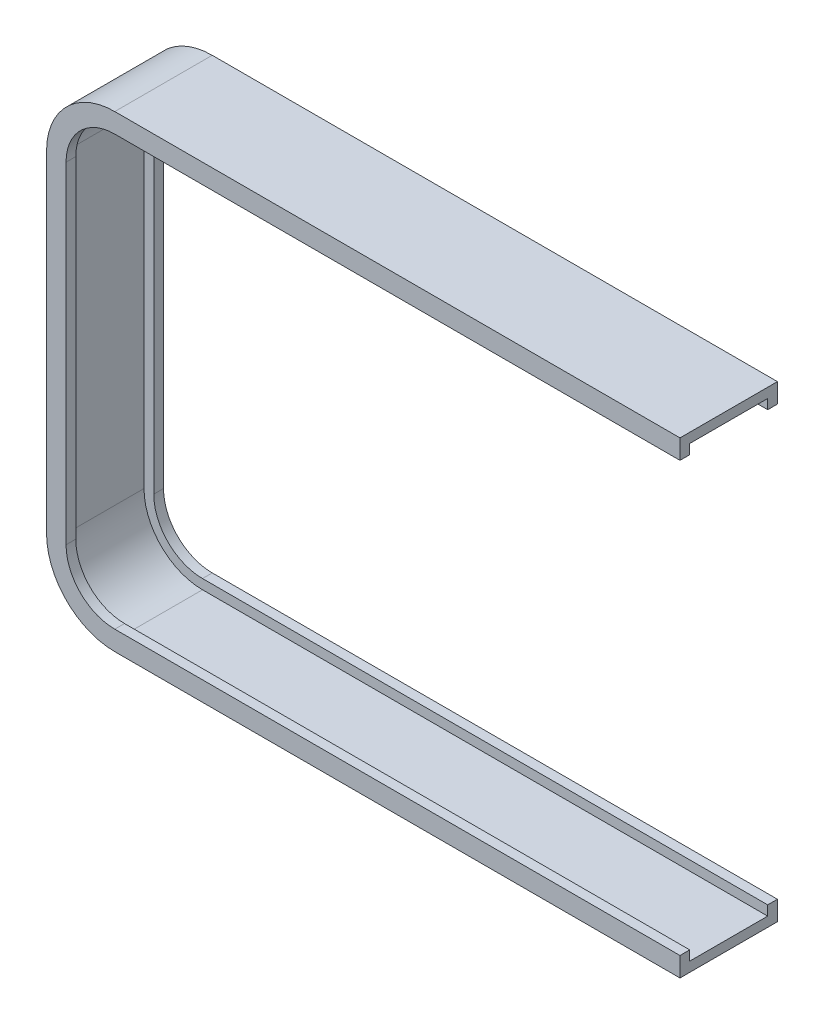
ISO-10303-21;
HEADER;
FILE_DESCRIPTION(('STEP AP214'),'2;1');
FILE_NAME('part.step','',(''),(''),'','','');
FILE_SCHEMA(('AUTOMOTIVE_DESIGN { 1 0 10303 214 1 1 1 1 }'));
ENDSEC;
DATA;
#1=APPLICATION_CONTEXT('core data for automotive mechanical design processes');
#2=APPLICATION_PROTOCOL_DEFINITION('international standard','automotive_design',2000,#1);
#3=PRODUCT_CONTEXT('',#1,'mechanical');
#4=PRODUCT('Part','Part','',(#3));
#5=PRODUCT_RELATED_PRODUCT_CATEGORY('part','',(#4));
#6=PRODUCT_DEFINITION_FORMATION('','',#4);
#7=PRODUCT_DEFINITION_CONTEXT('part definition',#1,'design');
#8=PRODUCT_DEFINITION('design','',#6,#7);
#9=PRODUCT_DEFINITION_SHAPE('','',#8);
#10=(LENGTH_UNIT() NAMED_UNIT(*) SI_UNIT(.MILLI.,.METRE.));
#11=(NAMED_UNIT(*) PLANE_ANGLE_UNIT() SI_UNIT($,.RADIAN.));
#12=(NAMED_UNIT(*) SI_UNIT($,.STERADIAN.) SOLID_ANGLE_UNIT());
#13=UNCERTAINTY_MEASURE_WITH_UNIT(LENGTH_MEASURE(1.E-05),#10,'distance_accuracy_value','');
#14=(GEOMETRIC_REPRESENTATION_CONTEXT(3) GLOBAL_UNCERTAINTY_ASSIGNED_CONTEXT((#13)) GLOBAL_UNIT_ASSIGNED_CONTEXT((#10,
#11,#12)) REPRESENTATION_CONTEXT('',''));
#15=CARTESIAN_POINT('',(0.,0.,0.));
#16=DIRECTION('',(0.,0.,1.));
#17=DIRECTION('',(1.,0.,0.));
#18=AXIS2_PLACEMENT_3D('',#15,#16,#17);
#19=CARTESIAN_POINT('',(32.4999999999998,85.0000000000196,40.));
#20=DIRECTION('',(0.,0.,-1.));
#21=DIRECTION('',(-1.,0.,0.));
#22=AXIS2_PLACEMENT_3D('',#19,#20,#21);
#23=CYLINDRICAL_SURFACE('',#22,30.0000000000008);
#24=CARTESIAN_POINT('',(32.4999999999998,85.0000000000196,0.));
#25=DIRECTION('',(0.,0.,-1.));
#26=DIRECTION('',(1.,0.,0.));
#27=AXIS2_PLACEMENT_3D('',#24,#25,#26);
#28=CIRCLE('',#27,30.0000000000008);
#29=CARTESIAN_POINT('',(2.49999999999902,85.0000000000198,0.));
#30=VERTEX_POINT('',#29);
#31=CARTESIAN_POINT('',(32.4999999999998,115.00000000002,0.));
#32=VERTEX_POINT('',#31);
#33=EDGE_CURVE('E377',#30,#32,#28,.T.);
#34=ORIENTED_EDGE('',*,*,#33,.T.);
#35=DIRECTION('',(0.,0.,-1.));
#36=VECTOR('',#35,1.);
#37=CARTESIAN_POINT('',(32.4999999999998,115.00000000002,40.));
#38=LINE('',#37,#36);
#39=CARTESIAN_POINT('',(32.4999999999998,115.00000000002,40.));
#40=VERTEX_POINT('',#39);
#41=EDGE_CURVE('E11',#40,#32,#38,.T.);
#42=ORIENTED_EDGE('',*,*,#41,.F.);
#43=CARTESIAN_POINT('',(32.4999999999998,85.0000000000196,40.));
#44=DIRECTION('',(0.,0.,-1.));
#45=DIRECTION('',(1.,0.,0.));
#46=AXIS2_PLACEMENT_3D('',#43,#44,#45);
#47=CIRCLE('',#46,30.0000000000008);
#48=CARTESIAN_POINT('',(2.49999999999902,85.0000000000198,40.));
#49=VERTEX_POINT('',#48);
#50=EDGE_CURVE('E378',#49,#40,#47,.T.);
#51=ORIENTED_EDGE('',*,*,#50,.F.);
#52=DIRECTION('',(0.,0.,-1.));
#53=VECTOR('',#52,1.);
#54=CARTESIAN_POINT('',(2.49999999999902,85.0000000000198,40.));
#55=LINE('',#54,#53);
#56=EDGE_CURVE('E391',#49,#30,#55,.T.);
#57=ORIENTED_EDGE('',*,*,#56,.T.);
#58=EDGE_LOOP('',(#34,#42,#51,#57));
#59=FACE_BOUND('',#58,.T.);
#60=ADVANCED_FACE('F39',(#59),#23,.F.);
#61=CARTESIAN_POINT('',(32.4999999999998,85.0000000000196,40.));
#62=DIRECTION('',(0.,0.,-1.));
#63=DIRECTION('',(-1.,0.,0.));
#64=AXIS2_PLACEMENT_3D('',#61,#62,#63);
#65=CYLINDRICAL_SURFACE('',#64,35.);
#66=DIRECTION('',(0.,0.,-1.));
#67=VECTOR('',#66,1.);
#68=CARTESIAN_POINT('',(32.4999999999998,120.00000000002,40.));
#69=LINE('',#68,#67);
#70=CARTESIAN_POINT('',(32.4999999999998,120.00000000002,45.));
#71=VERTEX_POINT('',#70);
#72=CARTESIAN_POINT('',(32.4999999999998,120.00000000002,-5.));
#73=VERTEX_POINT('',#72);
#74=EDGE_CURVE('E48',#71,#73,#69,.T.);
#75=ORIENTED_EDGE('',*,*,#74,.T.);
#76=CARTESIAN_POINT('',(32.4999999999998,85.0000000000198,-5.));
#77=DIRECTION('',(0.,0.,1.));
#78=DIRECTION('',(1.,0.,0.));
#79=AXIS2_PLACEMENT_3D('',#76,#77,#78);
#80=CIRCLE('',#79,35.);
#81=CARTESIAN_POINT('',(-2.50000000000018,85.0000000000198,-5.));
#82=VERTEX_POINT('',#81);
#83=EDGE_CURVE('E290',#73,#82,#80,.T.);
#84=ORIENTED_EDGE('',*,*,#83,.T.);
#85=DIRECTION('',(0.,0.,-1.));
#86=VECTOR('',#85,1.);
#87=CARTESIAN_POINT('',(-2.50000000000018,85.0000000000198,40.));
#88=LINE('',#87,#86);
#89=CARTESIAN_POINT('',(-2.50000000000018,85.0000000000198,45.));
#90=VERTEX_POINT('',#89);
#91=EDGE_CURVE('E415',#90,#82,#88,.T.);
#92=ORIENTED_EDGE('',*,*,#91,.F.);
#93=CARTESIAN_POINT('',(32.4999999999998,85.0000000000198,45.));
#94=DIRECTION('',(0.,0.,1.));
#95=DIRECTION('',(1.,0.,0.));
#96=AXIS2_PLACEMENT_3D('',#93,#94,#95);
#97=CIRCLE('',#96,35.);
#98=EDGE_CURVE('E337',#71,#90,#97,.T.);
#99=ORIENTED_EDGE('',*,*,#98,.F.);
#100=EDGE_LOOP('',(#75,#84,#92,#99));
#101=FACE_BOUND('',#100,.T.);
#102=ADVANCED_FACE('F421',(#101),#65,.T.);
#103=CARTESIAN_POINT('',(-2.50000000000018,-84.9999999999802,40.));
#104=DIRECTION('',(1.,0.,0.));
#105=DIRECTION('',(0.,0.,-1.));
#106=AXIS2_PLACEMENT_3D('',#103,#104,#105);
#107=PLANE('',#106);
#108=ORIENTED_EDGE('',*,*,#91,.T.);
#109=DIRECTION('',(0.,-1.,0.));
#110=VECTOR('',#109,1.);
#111=CARTESIAN_POINT('',(-2.50000000000018,85.0000000000198,-5.));
#112=LINE('',#111,#110);
#113=CARTESIAN_POINT('',(-2.50000000000018,-84.9999999999804,-5.));
#114=VERTEX_POINT('',#113);
#115=EDGE_CURVE('E309',#82,#114,#112,.T.);
#116=ORIENTED_EDGE('',*,*,#115,.T.);
#117=DIRECTION('',(0.,0.,-1.));
#118=VECTOR('',#117,1.);
#119=CARTESIAN_POINT('',(-2.50000000000018,-84.9999999999802,40.));
#120=LINE('',#119,#118);
#121=CARTESIAN_POINT('',(-2.50000000000018,-84.9999999999804,45.));
#122=VERTEX_POINT('',#121);
#123=EDGE_CURVE('E412',#122,#114,#120,.T.);
#124=ORIENTED_EDGE('',*,*,#123,.F.);
#125=DIRECTION('',(0.,-1.,0.));
#126=VECTOR('',#125,1.);
#127=CARTESIAN_POINT('',(-2.50000000000018,85.0000000000198,45.));
#128=LINE('',#127,#126);
#129=EDGE_CURVE('E340',#90,#122,#128,.T.);
#130=ORIENTED_EDGE('',*,*,#129,.F.);
#131=EDGE_LOOP('',(#108,#116,#124,#130));
#132=FACE_BOUND('',#131,.T.);
#133=ADVANCED_FACE('F433',(#132),#107,.F.);
#134=CARTESIAN_POINT('',(32.4999999999998,-84.9999999999802,40.));
#135=DIRECTION('',(0.,0.,-1.));
#136=DIRECTION('',(-1.,0.,0.));
#137=AXIS2_PLACEMENT_3D('',#134,#135,#136);
#138=CYLINDRICAL_SURFACE('',#137,35.);
#139=ORIENTED_EDGE('',*,*,#123,.T.);
#140=CARTESIAN_POINT('',(32.4999999999998,-84.9999999999804,-5.));
#141=DIRECTION('',(0.,0.,1.));
#142=DIRECTION('',(1.,0.,0.));
#143=AXIS2_PLACEMENT_3D('',#140,#141,#142);
#144=CIRCLE('',#143,35.);
#145=CARTESIAN_POINT('',(32.4999999999998,-119.99999999998,-5.));
#146=VERTEX_POINT('',#145);
#147=EDGE_CURVE('E306',#114,#146,#144,.T.);
#148=ORIENTED_EDGE('',*,*,#147,.T.);
#149=DIRECTION('',(0.,0.,-1.));
#150=VECTOR('',#149,1.);
#151=CARTESIAN_POINT('',(32.4999999999998,-119.99999999998,40.));
#152=LINE('',#151,#150);
#153=CARTESIAN_POINT('',(32.4999999999998,-119.99999999998,45.));
#154=VERTEX_POINT('',#153);
#155=EDGE_CURVE('E409',#154,#146,#152,.T.);
#156=ORIENTED_EDGE('',*,*,#155,.F.);
#157=CARTESIAN_POINT('',(32.4999999999998,-84.9999999999804,45.));
#158=DIRECTION('',(0.,0.,1.));
#159=DIRECTION('',(1.,0.,0.));
#160=AXIS2_PLACEMENT_3D('',#157,#158,#159);
#161=CIRCLE('',#160,35.);
#162=EDGE_CURVE('E224',#122,#154,#161,.T.);
#163=ORIENTED_EDGE('',*,*,#162,.F.);
#164=EDGE_LOOP('',(#139,#148,#156,#163));
#165=FACE_BOUND('',#164,.T.);
#166=ADVANCED_FACE('F561',(#165),#138,.T.);
#167=CARTESIAN_POINT('',(32.4999999999998,-84.9999999999802,40.));
#168=DIRECTION('',(0.,0.,-1.));
#169=DIRECTION('',(-1.,0.,0.));
#170=AXIS2_PLACEMENT_3D('',#167,#168,#169);
#171=CYLINDRICAL_SURFACE('',#170,30.0000000000008);
#172=CARTESIAN_POINT('',(32.4999999999998,-84.9999999999802,0.));
#173=DIRECTION('',(0.,0.,-1.));
#174=DIRECTION('',(1.,0.,0.));
#175=AXIS2_PLACEMENT_3D('',#172,#173,#174);
#176=CIRCLE('',#175,30.0000000000008);
#177=CARTESIAN_POINT('',(32.4999999999998,-114.999999999981,0.));
#178=VERTEX_POINT('',#177);
#179=CARTESIAN_POINT('',(2.49999999999902,-84.9999999999802,0.));
#180=VERTEX_POINT('',#179);
#181=EDGE_CURVE('E394',#178,#180,#176,.T.);
#182=ORIENTED_EDGE('',*,*,#181,.T.);
#183=DIRECTION('',(0.,0.,-1.));
#184=VECTOR('',#183,1.);
#185=CARTESIAN_POINT('',(2.49999999999902,-84.9999999999802,40.));
#186=LINE('',#185,#184);
#187=CARTESIAN_POINT('',(2.49999999999902,-84.9999999999802,40.));
#188=VERTEX_POINT('',#187);
#189=EDGE_CURVE('E55',#188,#180,#186,.T.);
#190=ORIENTED_EDGE('',*,*,#189,.F.);
#191=CARTESIAN_POINT('',(32.4999999999998,-84.9999999999802,40.));
#192=DIRECTION('',(0.,0.,-1.));
#193=DIRECTION('',(1.,0.,0.));
#194=AXIS2_PLACEMENT_3D('',#191,#192,#193);
#195=CIRCLE('',#194,30.0000000000008);
#196=CARTESIAN_POINT('',(32.4999999999998,-114.999999999981,40.));
#197=VERTEX_POINT('',#196);
#198=EDGE_CURVE('E382',#197,#188,#195,.T.);
#199=ORIENTED_EDGE('',*,*,#198,.F.);
#200=DIRECTION('',(0.,0.,-1.));
#201=VECTOR('',#200,1.);
#202=CARTESIAN_POINT('',(32.4999999999998,-114.999999999981,40.));
#203=LINE('',#202,#201);
#204=EDGE_CURVE('E405',#197,#178,#203,.T.);
#205=ORIENTED_EDGE('',*,*,#204,.T.);
#206=EDGE_LOOP('',(#182,#190,#199,#205));
#207=FACE_BOUND('',#206,.T.);
#208=ADVANCED_FACE('F559',(#207),#171,.F.);
#209=CARTESIAN_POINT('',(2.49999999999902,-84.9999999999802,40.));
#210=DIRECTION('',(-1.,0.,0.));
#211=DIRECTION('',(0.,0.,1.));
#212=AXIS2_PLACEMENT_3D('',#209,#210,#211);
#213=PLANE('',#212);
#214=DIRECTION('',(0.,1.,0.));
#215=VECTOR('',#214,1.);
#216=CARTESIAN_POINT('',(2.49999999999902,-84.9999999999802,0.));
#217=LINE('',#216,#215);
#218=EDGE_CURVE('E383',#180,#30,#217,.T.);
#219=ORIENTED_EDGE('',*,*,#218,.T.);
#220=ORIENTED_EDGE('',*,*,#56,.F.);
#221=DIRECTION('',(0.,1.,0.));
#222=VECTOR('',#221,1.);
#223=CARTESIAN_POINT('',(2.49999999999902,-84.9999999999802,40.));
#224=LINE('',#223,#222);
#225=EDGE_CURVE('E387',#188,#49,#224,.T.);
#226=ORIENTED_EDGE('',*,*,#225,.F.);
#227=ORIENTED_EDGE('',*,*,#189,.T.);
#228=EDGE_LOOP('',(#219,#220,#226,#227));
#229=FACE_BOUND('',#228,.T.);
#230=ADVANCED_FACE('F558',(#229),#213,.F.);
#231=CARTESIAN_POINT('',(32.4999999999998,85.0000000000198,40.));
#232=DIRECTION('',(0.,0.,1.));
#233=DIRECTION('',(1.,0.,0.));
#234=AXIS2_PLACEMENT_3D('',#231,#232,#233);
#235=PLANE('',#234);
#236=ORIENTED_EDGE('',*,*,#225,.T.);
#237=ORIENTED_EDGE('',*,*,#50,.T.);
#238=DIRECTION('',(-1.,0.,0.));
#239=VECTOR('',#238,1.);
#240=CARTESIAN_POINT('',(322.5,115.00000000002,40.));
#241=LINE('',#240,#239);
#242=CARTESIAN_POINT('',(322.5,115.00000000002,40.));
#243=VERTEX_POINT('',#242);
#244=EDGE_CURVE('E273',#243,#40,#241,.T.);
#245=ORIENTED_EDGE('',*,*,#244,.F.);
#246=DIRECTION('',(0.,1.,0.));
#247=VECTOR('',#246,1.);
#248=CARTESIAN_POINT('',(322.5,110.00000000002,40.));
#249=LINE('',#248,#247);
#250=CARTESIAN_POINT('',(322.5,110.00000000002,40.));
#251=VERTEX_POINT('',#250);
#252=EDGE_CURVE('E242',#251,#243,#249,.T.);
#253=ORIENTED_EDGE('',*,*,#252,.F.);
#254=DIRECTION('',(-1.,0.,0.));
#255=VECTOR('',#254,1.);
#256=CARTESIAN_POINT('',(322.5,110.00000000002,40.));
#257=LINE('',#256,#255);
#258=CARTESIAN_POINT('',(32.4999999999998,110.00000000002,40.));
#259=VERTEX_POINT('',#258);
#260=EDGE_CURVE('E277',#251,#259,#257,.T.);
#261=ORIENTED_EDGE('',*,*,#260,.T.);
#262=CARTESIAN_POINT('',(32.4999999999998,85.0000000000198,40.));
#263=DIRECTION('',(0.,0.,-1.));
#264=DIRECTION('',(1.,0.,0.));
#265=AXIS2_PLACEMENT_3D('',#262,#263,#264);
#266=CIRCLE('',#265,25.);
#267=CARTESIAN_POINT('',(7.49999999999982,85.0000000000198,40.));
#268=VERTEX_POINT('',#267);
#269=EDGE_CURVE('E341',#268,#259,#266,.T.);
#270=ORIENTED_EDGE('',*,*,#269,.F.);
#271=DIRECTION('',(0.,1.,0.));
#272=VECTOR('',#271,1.);
#273=CARTESIAN_POINT('',(7.49999999999982,85.0000000000198,40.));
#274=LINE('',#273,#272);
#275=CARTESIAN_POINT('',(7.49999999999984,-84.9999999999804,40.));
#276=VERTEX_POINT('',#275);
#277=EDGE_CURVE('E358',#276,#268,#274,.T.);
#278=ORIENTED_EDGE('',*,*,#277,.F.);
#279=CARTESIAN_POINT('',(32.4999999999998,-84.9999999999804,40.));
#280=DIRECTION('',(0.,0.,-1.));
#281=DIRECTION('',(1.,0.,0.));
#282=AXIS2_PLACEMENT_3D('',#279,#280,#281);
#283=CIRCLE('',#282,25.);
#284=CARTESIAN_POINT('',(32.4999999999998,-109.99999999998,40.));
#285=VERTEX_POINT('',#284);
#286=EDGE_CURVE('E336',#285,#276,#283,.T.);
#287=ORIENTED_EDGE('',*,*,#286,.F.);
#288=DIRECTION('',(-1.,0.,0.));
#289=VECTOR('',#288,1.);
#290=CARTESIAN_POINT('',(322.5,-109.99999999998,40.));
#291=LINE('',#290,#289);
#292=CARTESIAN_POINT('',(322.5,-109.99999999998,40.));
#293=VERTEX_POINT('',#292);
#294=EDGE_CURVE('E486',#293,#285,#291,.T.);
#295=ORIENTED_EDGE('',*,*,#294,.F.);
#296=DIRECTION('',(0.,1.,0.));
#297=VECTOR('',#296,1.);
#298=CARTESIAN_POINT('',(322.5,-109.99999999998,40.));
#299=LINE('',#298,#297);
#300=CARTESIAN_POINT('',(322.5,-114.999999999981,40.));
#301=VERTEX_POINT('',#300);
#302=EDGE_CURVE('E478',#301,#293,#299,.T.);
#303=ORIENTED_EDGE('',*,*,#302,.F.);
#304=DIRECTION('',(-1.,0.,0.));
#305=VECTOR('',#304,1.);
#306=CARTESIAN_POINT('',(322.5,-114.999999999981,40.));
#307=LINE('',#306,#305);
#308=EDGE_CURVE('E490',#301,#197,#307,.T.);
#309=ORIENTED_EDGE('',*,*,#308,.T.);
#310=ORIENTED_EDGE('',*,*,#198,.T.);
#311=EDGE_LOOP('',(#236,#237,#245,#253,#261,#270,#278,#287,#295,#303,#309,#310));
#312=FACE_BOUND('',#311,.T.);
#313=ADVANCED_FACE('F510',(#312),#235,.F.);
#314=CARTESIAN_POINT('',(32.4999999999998,-84.9999999999804,45.));
#315=DIRECTION('',(0.,0.,-1.));
#316=DIRECTION('',(-1.,0.,0.));
#317=AXIS2_PLACEMENT_3D('',#314,#315,#316);
#318=CYLINDRICAL_SURFACE('',#317,25.);
#319=ORIENTED_EDGE('',*,*,#286,.T.);
#320=DIRECTION('',(0.,0.,-1.));
#321=VECTOR('',#320,1.);
#322=CARTESIAN_POINT('',(7.49999999999984,-84.9999999999804,45.));
#323=LINE('',#322,#321);
#324=CARTESIAN_POINT('',(7.49999999999984,-84.9999999999804,45.));
#325=VERTEX_POINT('',#324);
#326=EDGE_CURVE('E370',#325,#276,#323,.T.);
#327=ORIENTED_EDGE('',*,*,#326,.F.);
#328=CARTESIAN_POINT('',(32.4999999999998,-84.9999999999804,45.));
#329=DIRECTION('',(0.,0.,-1.));
#330=DIRECTION('',(1.,0.,0.));
#331=AXIS2_PLACEMENT_3D('',#328,#329,#330);
#332=CIRCLE('',#331,25.);
#333=CARTESIAN_POINT('',(32.4999999999998,-109.99999999998,45.));
#334=VERTEX_POINT('',#333);
#335=EDGE_CURVE('E346',#334,#325,#332,.T.);
#336=ORIENTED_EDGE('',*,*,#335,.F.);
#337=DIRECTION('',(0.,0.,-1.));
#338=VECTOR('',#337,1.);
#339=CARTESIAN_POINT('',(32.4999999999998,-109.99999999998,45.));
#340=LINE('',#339,#338);
#341=EDGE_CURVE('E374',#334,#285,#340,.T.);
#342=ORIENTED_EDGE('',*,*,#341,.T.);
#343=EDGE_LOOP('',(#319,#327,#336,#342));
#344=FACE_BOUND('',#343,.T.);
#345=ADVANCED_FACE('F520',(#344),#318,.F.);
#346=CARTESIAN_POINT('',(7.49999999999982,85.0000000000198,45.));
#347=DIRECTION('',(-1.,0.,0.));
#348=DIRECTION('',(0.,-1.,0.));
#349=AXIS2_PLACEMENT_3D('',#346,#347,#348);
#350=PLANE('',#349);
#351=ORIENTED_EDGE('',*,*,#277,.T.);
#352=DIRECTION('',(0.,0.,-1.));
#353=VECTOR('',#352,1.);
#354=CARTESIAN_POINT('',(7.49999999999982,85.0000000000198,45.));
#355=LINE('',#354,#353);
#356=CARTESIAN_POINT('',(7.49999999999982,85.0000000000198,45.));
#357=VERTEX_POINT('',#356);
#358=EDGE_CURVE('E366',#357,#268,#355,.T.);
#359=ORIENTED_EDGE('',*,*,#358,.F.);
#360=DIRECTION('',(0.,1.,0.));
#361=VECTOR('',#360,1.);
#362=CARTESIAN_POINT('',(7.49999999999982,85.0000000000198,45.));
#363=LINE('',#362,#361);
#364=EDGE_CURVE('E349',#325,#357,#363,.T.);
#365=ORIENTED_EDGE('',*,*,#364,.F.);
#366=ORIENTED_EDGE('',*,*,#326,.T.);
#367=EDGE_LOOP('',(#351,#359,#365,#366));
#368=FACE_BOUND('',#367,.T.);
#369=ADVANCED_FACE('F522',(#368),#350,.F.);
#370=CARTESIAN_POINT('',(32.4999999999998,85.0000000000198,45.));
#371=DIRECTION('',(0.,0.,-1.));
#372=DIRECTION('',(-1.,0.,0.));
#373=AXIS2_PLACEMENT_3D('',#370,#371,#372);
#374=CYLINDRICAL_SURFACE('',#373,25.);
#375=ORIENTED_EDGE('',*,*,#269,.T.);
#376=DIRECTION('',(0.,0.,-1.));
#377=VECTOR('',#376,1.);
#378=CARTESIAN_POINT('',(32.4999999999998,110.00000000002,45.));
#379=LINE('',#378,#377);
#380=CARTESIAN_POINT('',(32.4999999999998,110.00000000002,45.));
#381=VERTEX_POINT('',#380);
#382=EDGE_CURVE('E355',#381,#259,#379,.T.);
#383=ORIENTED_EDGE('',*,*,#382,.F.);
#384=CARTESIAN_POINT('',(32.4999999999998,85.0000000000198,45.));
#385=DIRECTION('',(0.,0.,-1.));
#386=DIRECTION('',(1.,0.,0.));
#387=AXIS2_PLACEMENT_3D('',#384,#385,#386);
#388=CIRCLE('',#387,25.);
#389=EDGE_CURVE('E352',#357,#381,#388,.T.);
#390=ORIENTED_EDGE('',*,*,#389,.F.);
#391=ORIENTED_EDGE('',*,*,#358,.T.);
#392=EDGE_LOOP('',(#375,#383,#390,#391));
#393=FACE_BOUND('',#392,.T.);
#394=ADVANCED_FACE('F527',(#393),#374,.F.);
#395=CARTESIAN_POINT('',(32.4999999999998,85.0000000000198,45.));
#396=DIRECTION('',(0.,0.,1.));
#397=DIRECTION('',(1.,0.,0.));
#398=AXIS2_PLACEMENT_3D('',#395,#396,#397);
#399=PLANE('',#398);
#400=ORIENTED_EDGE('',*,*,#98,.T.);
#401=ORIENTED_EDGE('',*,*,#129,.T.);
#402=ORIENTED_EDGE('',*,*,#162,.T.);
#403=DIRECTION('',(-1.,0.,0.));
#404=VECTOR('',#403,1.);
#405=CARTESIAN_POINT('',(322.5,-119.99999999998,45.));
#406=LINE('',#405,#404);
#407=CARTESIAN_POINT('',(322.5,-119.99999999998,45.));
#408=VERTEX_POINT('',#407);
#409=EDGE_CURVE('E201',#408,#154,#406,.T.);
#410=ORIENTED_EDGE('',*,*,#409,.F.);
#411=DIRECTION('',(0.,-1.,0.));
#412=VECTOR('',#411,1.);
#413=CARTESIAN_POINT('',(322.5,-119.99999999998,45.));
#414=LINE('',#413,#412);
#415=CARTESIAN_POINT('',(322.5,-109.99999999998,45.));
#416=VERTEX_POINT('',#415);
#417=EDGE_CURVE('E208',#416,#408,#414,.T.);
#418=ORIENTED_EDGE('',*,*,#417,.F.);
#419=DIRECTION('',(-1.,0.,0.));
#420=VECTOR('',#419,1.);
#421=CARTESIAN_POINT('',(322.5,-109.99999999998,45.));
#422=LINE('',#421,#420);
#423=EDGE_CURVE('E483',#416,#334,#422,.T.);
#424=ORIENTED_EDGE('',*,*,#423,.T.);
#425=ORIENTED_EDGE('',*,*,#335,.T.);
#426=ORIENTED_EDGE('',*,*,#364,.T.);
#427=ORIENTED_EDGE('',*,*,#389,.T.);
#428=DIRECTION('',(-1.,0.,0.));
#429=VECTOR('',#428,1.);
#430=CARTESIAN_POINT('',(322.5,110.00000000002,45.));
#431=LINE('',#430,#429);
#432=CARTESIAN_POINT('',(322.5,110.00000000002,45.));
#433=VERTEX_POINT('',#432);
#434=EDGE_CURVE('E281',#433,#381,#431,.T.);
#435=ORIENTED_EDGE('',*,*,#434,.F.);
#436=DIRECTION('',(0.,-1.,0.));
#437=VECTOR('',#436,1.);
#438=CARTESIAN_POINT('',(322.5,120.00000000002,45.));
#439=LINE('',#438,#437);
#440=CARTESIAN_POINT('',(322.5,120.00000000002,45.));
#441=VERTEX_POINT('',#440);
#442=EDGE_CURVE('E231',#441,#433,#439,.T.);
#443=ORIENTED_EDGE('',*,*,#442,.F.);
#444=DIRECTION('',(-1.,0.,0.));
#445=VECTOR('',#444,1.);
#446=CARTESIAN_POINT('',(322.5,120.00000000002,45.));
#447=LINE('',#446,#445);
#448=EDGE_CURVE('E285',#441,#71,#447,.T.);
#449=ORIENTED_EDGE('',*,*,#448,.T.);
#450=EDGE_LOOP('',(#400,#401,#402,#410,#418,#424,#425,#426,#427,#435,#443,#449));
#451=FACE_BOUND('',#450,.T.);
#452=ADVANCED_FACE('F221',(#451),#399,.T.);
#453=CARTESIAN_POINT('',(32.4999999999998,85.0000000000198,0.));
#454=DIRECTION('',(0.,0.,-1.));
#455=DIRECTION('',(1.,0.,0.));
#456=AXIS2_PLACEMENT_3D('',#453,#454,#455);
#457=PLANE('',#456);
#458=ORIENTED_EDGE('',*,*,#33,.F.);
#459=ORIENTED_EDGE('',*,*,#218,.F.);
#460=ORIENTED_EDGE('',*,*,#181,.F.);
#461=DIRECTION('',(-1.,0.,0.));
#462=VECTOR('',#461,1.);
#463=CARTESIAN_POINT('',(322.5,-114.999999999981,0.));
#464=LINE('',#463,#462);
#465=CARTESIAN_POINT('',(322.5,-114.999999999981,0.));
#466=VERTEX_POINT('',#465);
#467=EDGE_CURVE('E494',#466,#178,#464,.T.);
#468=ORIENTED_EDGE('',*,*,#467,.F.);
#469=DIRECTION('',(0.,-1.,0.));
#470=VECTOR('',#469,1.);
#471=CARTESIAN_POINT('',(322.5,-114.999999999981,0.));
#472=LINE('',#471,#470);
#473=CARTESIAN_POINT('',(322.5,-109.99999999998,0.));
#474=VERTEX_POINT('',#473);
#475=EDGE_CURVE('E468',#474,#466,#472,.T.);
#476=ORIENTED_EDGE('',*,*,#475,.F.);
#477=DIRECTION('',(-1.,0.,0.));
#478=VECTOR('',#477,1.);
#479=CARTESIAN_POINT('',(322.5,-109.99999999998,0.));
#480=LINE('',#479,#478);
#481=CARTESIAN_POINT('',(32.4999999999998,-109.99999999998,0.));
#482=VERTEX_POINT('',#481);
#483=EDGE_CURVE('E461',#474,#482,#480,.T.);
#484=ORIENTED_EDGE('',*,*,#483,.T.);
#485=CARTESIAN_POINT('',(32.4999999999998,-84.9999999999804,0.));
#486=DIRECTION('',(0.,0.,-1.));
#487=DIRECTION('',(1.,0.,0.));
#488=AXIS2_PLACEMENT_3D('',#485,#486,#487);
#489=CIRCLE('',#488,25.);
#490=CARTESIAN_POINT('',(7.49999999999984,-84.9999999999804,0.));
#491=VERTEX_POINT('',#490);
#492=EDGE_CURVE('E295',#482,#491,#489,.T.);
#493=ORIENTED_EDGE('',*,*,#492,.T.);
#494=DIRECTION('',(0.,1.,0.));
#495=VECTOR('',#494,1.);
#496=CARTESIAN_POINT('',(7.49999999999982,85.0000000000198,0.));
#497=LINE('',#496,#495);
#498=CARTESIAN_POINT('',(7.49999999999982,85.0000000000198,0.));
#499=VERTEX_POINT('',#498);
#500=EDGE_CURVE('E317',#491,#499,#497,.T.);
#501=ORIENTED_EDGE('',*,*,#500,.T.);
#502=CARTESIAN_POINT('',(32.4999999999998,85.0000000000198,0.));
#503=DIRECTION('',(0.,0.,-1.));
#504=DIRECTION('',(1.,0.,0.));
#505=AXIS2_PLACEMENT_3D('',#502,#503,#504);
#506=CIRCLE('',#505,25.);
#507=CARTESIAN_POINT('',(32.4999999999998,110.00000000002,0.));
#508=VERTEX_POINT('',#507);
#509=EDGE_CURVE('E289',#499,#508,#506,.T.);
#510=ORIENTED_EDGE('',*,*,#509,.T.);
#511=DIRECTION('',(-1.,0.,0.));
#512=VECTOR('',#511,1.);
#513=CARTESIAN_POINT('',(322.5,110.00000000002,0.));
#514=LINE('',#513,#512);
#515=CARTESIAN_POINT('',(322.5,110.00000000002,0.));
#516=VERTEX_POINT('',#515);
#517=EDGE_CURVE('E265',#516,#508,#514,.T.);
#518=ORIENTED_EDGE('',*,*,#517,.F.);
#519=DIRECTION('',(0.,-1.,0.));
#520=VECTOR('',#519,1.);
#521=CARTESIAN_POINT('',(322.5,115.00000000002,0.));
#522=LINE('',#521,#520);
#523=CARTESIAN_POINT('',(322.5,115.00000000002,0.));
#524=VERTEX_POINT('',#523);
#525=EDGE_CURVE('E248',#524,#516,#522,.T.);
#526=ORIENTED_EDGE('',*,*,#525,.F.);
#527=DIRECTION('',(-1.,0.,0.));
#528=VECTOR('',#527,1.);
#529=CARTESIAN_POINT('',(322.5,115.00000000002,0.));
#530=LINE('',#529,#528);
#531=EDGE_CURVE('E269',#524,#32,#530,.T.);
#532=ORIENTED_EDGE('',*,*,#531,.T.);
#533=EDGE_LOOP('',(#458,#459,#460,#468,#476,#484,#493,#501,#510,#518,#526,#532));
#534=FACE_BOUND('',#533,.T.);
#535=ADVANCED_FACE('F500',(#534),#457,.F.);
#536=CARTESIAN_POINT('',(32.4999999999998,85.0000000000198,-5.));
#537=DIRECTION('',(0.,0.,1.));
#538=DIRECTION('',(1.,0.,0.));
#539=AXIS2_PLACEMENT_3D('',#536,#537,#538);
#540=CYLINDRICAL_SURFACE('',#539,25.);
#541=ORIENTED_EDGE('',*,*,#509,.F.);
#542=DIRECTION('',(0.,0.,1.));
#543=VECTOR('',#542,1.);
#544=CARTESIAN_POINT('',(7.49999999999982,85.0000000000198,-5.));
#545=LINE('',#544,#543);
#546=CARTESIAN_POINT('',(7.49999999999982,85.0000000000198,-5.));
#547=VERTEX_POINT('',#546);
#548=EDGE_CURVE('E330',#547,#499,#545,.T.);
#549=ORIENTED_EDGE('',*,*,#548,.F.);
#550=CARTESIAN_POINT('',(32.4999999999998,85.0000000000198,-5.));
#551=DIRECTION('',(0.,0.,-1.));
#552=DIRECTION('',(1.,0.,0.));
#553=AXIS2_PLACEMENT_3D('',#550,#551,#552);
#554=CIRCLE('',#553,25.);
#555=CARTESIAN_POINT('',(32.4999999999998,110.00000000002,-5.));
#556=VERTEX_POINT('',#555);
#557=EDGE_CURVE('E294',#547,#556,#554,.T.);
#558=ORIENTED_EDGE('',*,*,#557,.T.);
#559=DIRECTION('',(0.,0.,1.));
#560=VECTOR('',#559,1.);
#561=CARTESIAN_POINT('',(32.4999999999998,110.00000000002,-5.));
#562=LINE('',#561,#560);
#563=EDGE_CURVE('E333',#556,#508,#562,.T.);
#564=ORIENTED_EDGE('',*,*,#563,.T.);
#565=EDGE_LOOP('',(#541,#549,#558,#564));
#566=FACE_BOUND('',#565,.T.);
#567=ADVANCED_FACE('F537',(#566),#540,.F.);
#568=CARTESIAN_POINT('',(7.49999999999982,85.0000000000198,-5.));
#569=DIRECTION('',(1.,0.,0.));
#570=DIRECTION('',(0.,1.,0.));
#571=AXIS2_PLACEMENT_3D('',#568,#569,#570);
#572=PLANE('',#571);
#573=ORIENTED_EDGE('',*,*,#500,.F.);
#574=DIRECTION('',(0.,0.,1.));
#575=VECTOR('',#574,1.);
#576=CARTESIAN_POINT('',(7.49999999999984,-84.9999999999804,-5.));
#577=LINE('',#576,#575);
#578=CARTESIAN_POINT('',(7.49999999999984,-84.9999999999804,-5.));
#579=VERTEX_POINT('',#578);
#580=EDGE_CURVE('E327',#579,#491,#577,.T.);
#581=ORIENTED_EDGE('',*,*,#580,.F.);
#582=DIRECTION('',(0.,1.,0.));
#583=VECTOR('',#582,1.);
#584=CARTESIAN_POINT('',(7.49999999999982,85.0000000000198,-5.));
#585=LINE('',#584,#583);
#586=EDGE_CURVE('E298',#579,#547,#585,.T.);
#587=ORIENTED_EDGE('',*,*,#586,.T.);
#588=ORIENTED_EDGE('',*,*,#548,.T.);
#589=EDGE_LOOP('',(#573,#581,#587,#588));
#590=FACE_BOUND('',#589,.T.);
#591=ADVANCED_FACE('F451',(#590),#572,.T.);
#592=CARTESIAN_POINT('',(32.4999999999998,-84.9999999999804,-5.));
#593=DIRECTION('',(0.,0.,1.));
#594=DIRECTION('',(1.,0.,0.));
#595=AXIS2_PLACEMENT_3D('',#592,#593,#594);
#596=CYLINDRICAL_SURFACE('',#595,25.);
#597=ORIENTED_EDGE('',*,*,#492,.F.);
#598=DIRECTION('',(0.,0.,1.));
#599=VECTOR('',#598,1.);
#600=CARTESIAN_POINT('',(32.4999999999998,-109.99999999998,-5.));
#601=LINE('',#600,#599);
#602=CARTESIAN_POINT('',(32.4999999999998,-109.99999999998,-5.));
#603=VERTEX_POINT('',#602);
#604=EDGE_CURVE('E313',#603,#482,#601,.T.);
#605=ORIENTED_EDGE('',*,*,#604,.F.);
#606=CARTESIAN_POINT('',(32.4999999999998,-84.9999999999804,-5.));
#607=DIRECTION('',(0.,0.,-1.));
#608=DIRECTION('',(1.,0.,0.));
#609=AXIS2_PLACEMENT_3D('',#606,#607,#608);
#610=CIRCLE('',#609,25.);
#611=EDGE_CURVE('E302',#603,#579,#610,.T.);
#612=ORIENTED_EDGE('',*,*,#611,.T.);
#613=ORIENTED_EDGE('',*,*,#580,.T.);
#614=EDGE_LOOP('',(#597,#605,#612,#613));
#615=FACE_BOUND('',#614,.T.);
#616=ADVANCED_FACE('F454',(#615),#596,.F.);
#617=CARTESIAN_POINT('',(32.4999999999998,85.0000000000198,-5.));
#618=DIRECTION('',(0.,0.,-1.));
#619=DIRECTION('',(1.,0.,0.));
#620=AXIS2_PLACEMENT_3D('',#617,#618,#619);
#621=PLANE('',#620);
#622=ORIENTED_EDGE('',*,*,#83,.F.);
#623=DIRECTION('',(-1.,0.,0.));
#624=VECTOR('',#623,1.);
#625=CARTESIAN_POINT('',(322.5,120.00000000002,-5.));
#626=LINE('',#625,#624);
#627=CARTESIAN_POINT('',(322.5,120.00000000002,-5.));
#628=VERTEX_POINT('',#627);
#629=EDGE_CURVE('E257',#628,#73,#626,.T.);
#630=ORIENTED_EDGE('',*,*,#629,.F.);
#631=DIRECTION('',(0.,1.,0.));
#632=VECTOR('',#631,1.);
#633=CARTESIAN_POINT('',(322.5,110.00000000002,-5.));
#634=LINE('',#633,#632);
#635=CARTESIAN_POINT('',(322.5,110.00000000002,-5.));
#636=VERTEX_POINT('',#635);
#637=EDGE_CURVE('E254',#636,#628,#634,.T.);
#638=ORIENTED_EDGE('',*,*,#637,.F.);
#639=DIRECTION('',(-1.,0.,0.));
#640=VECTOR('',#639,1.);
#641=CARTESIAN_POINT('',(322.5,110.00000000002,-5.));
#642=LINE('',#641,#640);
#643=EDGE_CURVE('E261',#636,#556,#642,.T.);
#644=ORIENTED_EDGE('',*,*,#643,.T.);
#645=ORIENTED_EDGE('',*,*,#557,.F.);
#646=ORIENTED_EDGE('',*,*,#586,.F.);
#647=ORIENTED_EDGE('',*,*,#611,.F.);
#648=DIRECTION('',(-1.,0.,0.));
#649=VECTOR('',#648,1.);
#650=CARTESIAN_POINT('',(322.5,-109.99999999998,-5.));
#651=LINE('',#650,#649);
#652=CARTESIAN_POINT('',(322.5,-109.99999999998,-5.));
#653=VERTEX_POINT('',#652);
#654=EDGE_CURVE('E233',#653,#603,#651,.T.);
#655=ORIENTED_EDGE('',*,*,#654,.F.);
#656=DIRECTION('',(0.,1.,0.));
#657=VECTOR('',#656,1.);
#658=CARTESIAN_POINT('',(322.5,-109.99999999998,-5.));
#659=LINE('',#658,#657);
#660=CARTESIAN_POINT('',(322.5,-119.99999999998,-5.));
#661=VERTEX_POINT('',#660);
#662=EDGE_CURVE('E207',#661,#653,#659,.T.);
#663=ORIENTED_EDGE('',*,*,#662,.F.);
#664=DIRECTION('',(-1.,0.,0.));
#665=VECTOR('',#664,1.);
#666=CARTESIAN_POINT('',(322.5,-119.99999999998,-5.));
#667=LINE('',#666,#665);
#668=EDGE_CURVE('E203',#661,#146,#667,.T.);
#669=ORIENTED_EDGE('',*,*,#668,.T.);
#670=ORIENTED_EDGE('',*,*,#147,.F.);
#671=ORIENTED_EDGE('',*,*,#115,.F.);
#672=EDGE_LOOP('',(#622,#630,#638,#644,#645,#646,#647,#655,#663,#669,#670,#671));
#673=FACE_BOUND('',#672,.T.);
#674=ADVANCED_FACE('F430',(#673),#621,.T.);
#675=CARTESIAN_POINT('',(322.5,120.00000000002,-5.));
#676=DIRECTION('',(0.,-1.,0.));
#677=DIRECTION('',(0.,0.,-1.));
#678=AXIS2_PLACEMENT_3D('',#675,#676,#677);
#679=PLANE('',#678);
#680=ORIENTED_EDGE('',*,*,#74,.F.);
#681=ORIENTED_EDGE('',*,*,#448,.F.);
#682=DIRECTION('',(0.,0.,1.));
#683=VECTOR('',#682,1.);
#684=CARTESIAN_POINT('',(322.5,120.00000000002,-5.));
#685=LINE('',#684,#683);
#686=EDGE_CURVE('E226',#628,#441,#685,.T.);
#687=ORIENTED_EDGE('',*,*,#686,.F.);
#688=ORIENTED_EDGE('',*,*,#629,.T.);
#689=EDGE_LOOP('',(#680,#681,#687,#688));
#690=FACE_BOUND('',#689,.T.);
#691=ADVANCED_FACE('F427',(#690),#679,.F.);
#692=CARTESIAN_POINT('',(322.5,110.00000000002,45.));
#693=DIRECTION('',(0.,1.,0.));
#694=DIRECTION('',(0.,0.,1.));
#695=AXIS2_PLACEMENT_3D('',#692,#693,#694);
#696=PLANE('',#695);
#697=ORIENTED_EDGE('',*,*,#382,.T.);
#698=ORIENTED_EDGE('',*,*,#260,.F.);
#699=DIRECTION('',(0.,0.,-1.));
#700=VECTOR('',#699,1.);
#701=CARTESIAN_POINT('',(322.5,110.00000000002,45.));
#702=LINE('',#701,#700);
#703=EDGE_CURVE('E239',#433,#251,#702,.T.);
#704=ORIENTED_EDGE('',*,*,#703,.F.);
#705=ORIENTED_EDGE('',*,*,#434,.T.);
#706=EDGE_LOOP('',(#697,#698,#704,#705));
#707=FACE_BOUND('',#706,.T.);
#708=ADVANCED_FACE('F530',(#707),#696,.F.);
#709=CARTESIAN_POINT('',(322.5,115.00000000002,40.));
#710=DIRECTION('',(0.,1.,0.));
#711=DIRECTION('',(0.,0.,1.));
#712=AXIS2_PLACEMENT_3D('',#709,#710,#711);
#713=PLANE('',#712);
#714=ORIENTED_EDGE('',*,*,#41,.T.);
#715=ORIENTED_EDGE('',*,*,#531,.F.);
#716=DIRECTION('',(0.,0.,-1.));
#717=VECTOR('',#716,1.);
#718=CARTESIAN_POINT('',(322.5,115.00000000002,40.));
#719=LINE('',#718,#717);
#720=EDGE_CURVE('E245',#243,#524,#719,.T.);
#721=ORIENTED_EDGE('',*,*,#720,.F.);
#722=ORIENTED_EDGE('',*,*,#244,.T.);
#723=EDGE_LOOP('',(#714,#715,#721,#722));
#724=FACE_BOUND('',#723,.T.);
#725=ADVANCED_FACE('F536',(#724),#713,.F.);
#726=CARTESIAN_POINT('',(322.5,110.00000000002,0.));
#727=DIRECTION('',(0.,1.,0.));
#728=DIRECTION('',(0.,0.,1.));
#729=AXIS2_PLACEMENT_3D('',#726,#727,#728);
#730=PLANE('',#729);
#731=ORIENTED_EDGE('',*,*,#563,.F.);
#732=ORIENTED_EDGE('',*,*,#643,.F.);
#733=DIRECTION('',(0.,0.,-1.));
#734=VECTOR('',#733,1.);
#735=CARTESIAN_POINT('',(322.5,110.00000000002,0.));
#736=LINE('',#735,#734);
#737=EDGE_CURVE('E251',#516,#636,#736,.T.);
#738=ORIENTED_EDGE('',*,*,#737,.F.);
#739=ORIENTED_EDGE('',*,*,#517,.T.);
#740=EDGE_LOOP('',(#731,#732,#738,#739));
#741=FACE_BOUND('',#740,.T.);
#742=ADVANCED_FACE('F445',(#741),#730,.F.);
#743=CARTESIAN_POINT('',(322.5,0.,0.));
#744=DIRECTION('',(1.,0.,0.));
#745=DIRECTION('',(0.,0.,-1.));
#746=AXIS2_PLACEMENT_3D('',#743,#744,#745);
#747=PLANE('',#746);
#748=ORIENTED_EDGE('',*,*,#686,.T.);
#749=ORIENTED_EDGE('',*,*,#442,.T.);
#750=ORIENTED_EDGE('',*,*,#703,.T.);
#751=ORIENTED_EDGE('',*,*,#252,.T.);
#752=ORIENTED_EDGE('',*,*,#720,.T.);
#753=ORIENTED_EDGE('',*,*,#525,.T.);
#754=ORIENTED_EDGE('',*,*,#737,.T.);
#755=ORIENTED_EDGE('',*,*,#637,.T.);
#756=EDGE_LOOP('',(#748,#749,#750,#751,#752,#753,#754,#755));
#757=FACE_BOUND('',#756,.T.);
#758=ADVANCED_FACE('F438',(#757),#747,.T.);
#759=CARTESIAN_POINT('',(322.5,-119.99999999998,-5.));
#760=DIRECTION('',(0.,1.,0.));
#761=DIRECTION('',(0.,0.,1.));
#762=AXIS2_PLACEMENT_3D('',#759,#760,#761);
#763=PLANE('',#762);
#764=ORIENTED_EDGE('',*,*,#155,.T.);
#765=ORIENTED_EDGE('',*,*,#668,.F.);
#766=DIRECTION('',(0.,0.,-1.));
#767=VECTOR('',#766,1.);
#768=CARTESIAN_POINT('',(322.5,-119.99999999998,-5.));
#769=LINE('',#768,#767);
#770=EDGE_CURVE('E196',#408,#661,#769,.T.);
#771=ORIENTED_EDGE('',*,*,#770,.F.);
#772=ORIENTED_EDGE('',*,*,#409,.T.);
#773=EDGE_LOOP('',(#764,#765,#771,#772));
#774=FACE_BOUND('',#773,.T.);
#775=ADVANCED_FACE('F199',(#774),#763,.F.);
#776=CARTESIAN_POINT('',(322.5,-109.99999999998,0.));
#777=DIRECTION('',(0.,-1.,0.));
#778=DIRECTION('',(0.,0.,-1.));
#779=AXIS2_PLACEMENT_3D('',#776,#777,#778);
#780=PLANE('',#779);
#781=ORIENTED_EDGE('',*,*,#604,.T.);
#782=ORIENTED_EDGE('',*,*,#483,.F.);
#783=DIRECTION('',(0.,0.,1.));
#784=VECTOR('',#783,1.);
#785=CARTESIAN_POINT('',(322.5,-109.99999999998,0.));
#786=LINE('',#785,#784);
#787=EDGE_CURVE('E463',#653,#474,#786,.T.);
#788=ORIENTED_EDGE('',*,*,#787,.F.);
#789=ORIENTED_EDGE('',*,*,#654,.T.);
#790=EDGE_LOOP('',(#781,#782,#788,#789));
#791=FACE_BOUND('',#790,.T.);
#792=ADVANCED_FACE('F464',(#791),#780,.F.);
#793=CARTESIAN_POINT('',(322.5,-114.999999999981,40.));
#794=DIRECTION('',(0.,-1.,0.));
#795=DIRECTION('',(0.,0.,-1.));
#796=AXIS2_PLACEMENT_3D('',#793,#794,#795);
#797=PLANE('',#796);
#798=ORIENTED_EDGE('',*,*,#204,.F.);
#799=ORIENTED_EDGE('',*,*,#308,.F.);
#800=DIRECTION('',(0.,0.,1.));
#801=VECTOR('',#800,1.);
#802=CARTESIAN_POINT('',(322.5,-114.999999999981,40.));
#803=LINE('',#802,#801);
#804=EDGE_CURVE('E472',#466,#301,#803,.T.);
#805=ORIENTED_EDGE('',*,*,#804,.F.);
#806=ORIENTED_EDGE('',*,*,#467,.T.);
#807=EDGE_LOOP('',(#798,#799,#805,#806));
#808=FACE_BOUND('',#807,.T.);
#809=ADVANCED_FACE('F508',(#808),#797,.F.);
#810=CARTESIAN_POINT('',(322.5,-109.99999999998,45.));
#811=DIRECTION('',(0.,-1.,0.));
#812=DIRECTION('',(0.,0.,-1.));
#813=AXIS2_PLACEMENT_3D('',#810,#811,#812);
#814=PLANE('',#813);
#815=ORIENTED_EDGE('',*,*,#341,.F.);
#816=ORIENTED_EDGE('',*,*,#423,.F.);
#817=DIRECTION('',(0.,0.,1.));
#818=VECTOR('',#817,1.);
#819=CARTESIAN_POINT('',(322.5,-109.99999999998,45.));
#820=LINE('',#819,#818);
#821=EDGE_CURVE('E213',#293,#416,#820,.T.);
#822=ORIENTED_EDGE('',*,*,#821,.F.);
#823=ORIENTED_EDGE('',*,*,#294,.T.);
#824=EDGE_LOOP('',(#815,#816,#822,#823));
#825=FACE_BOUND('',#824,.T.);
#826=ADVANCED_FACE('F515',(#825),#814,.F.);
#827=CARTESIAN_POINT('',(322.5,0.,0.));
#828=DIRECTION('',(-1.,0.,0.));
#829=DIRECTION('',(0.,0.,1.));
#830=AXIS2_PLACEMENT_3D('',#827,#828,#829);
#831=PLANE('',#830);
#832=ORIENTED_EDGE('',*,*,#417,.T.);
#833=ORIENTED_EDGE('',*,*,#770,.T.);
#834=ORIENTED_EDGE('',*,*,#662,.T.);
#835=ORIENTED_EDGE('',*,*,#787,.T.);
#836=ORIENTED_EDGE('',*,*,#475,.T.);
#837=ORIENTED_EDGE('',*,*,#804,.T.);
#838=ORIENTED_EDGE('',*,*,#302,.T.);
#839=ORIENTED_EDGE('',*,*,#821,.T.);
#840=EDGE_LOOP('',(#832,#833,#834,#835,#836,#837,#838,#839));
#841=FACE_BOUND('',#840,.T.);
#842=ADVANCED_FACE('F211',(#841),#831,.F.);
#843=CLOSED_SHELL('',(#60,#102,#133,#166,#208,#230,#313,#345,#369,#394,#452,#535,#567,#591,#616,
#674,#691,#708,#725,#742,#758,#775,#792,#809,#826,#842));
#844=MANIFOLD_SOLID_BREP('B2',#843);
#845=ADVANCED_BREP_SHAPE_REPRESENTATION('',(#18,#844),#14);
#846=SHAPE_DEFINITION_REPRESENTATION(#9,#845);
ENDSEC;
END-ISO-10303-21;
